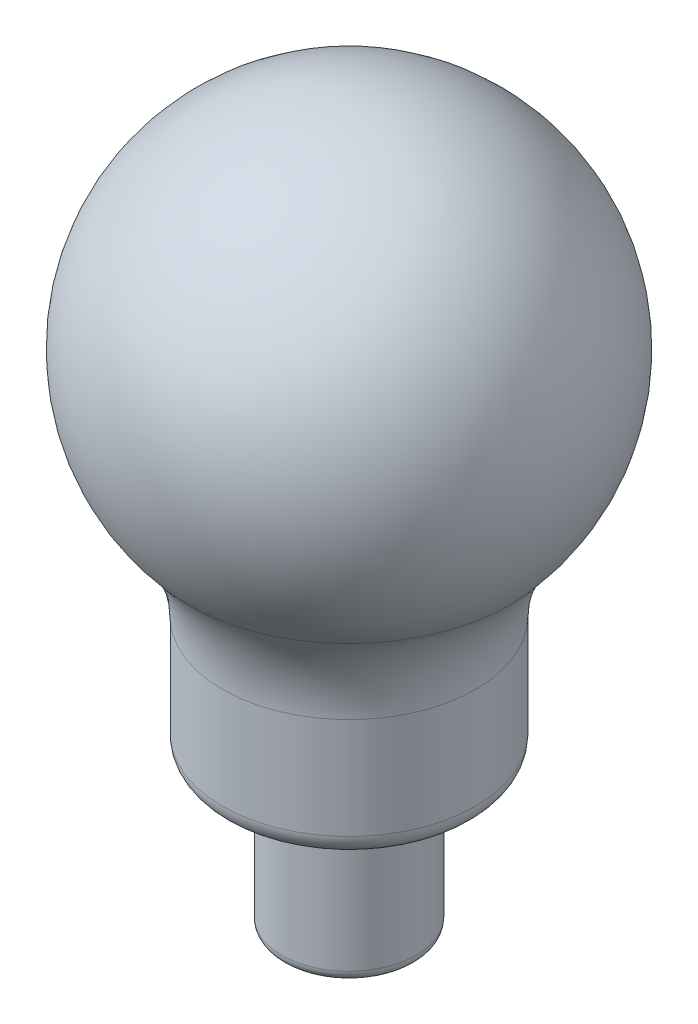
ISO-10303-21;
HEADER;
FILE_DESCRIPTION(('STEP AP214'),'2;1');
FILE_NAME('part.step','',(''),(''),'','','');
FILE_SCHEMA(('AUTOMOTIVE_DESIGN { 1 0 10303 214 1 1 1 1 }'));
ENDSEC;
DATA;
#1=APPLICATION_CONTEXT('core data for automotive mechanical design processes');
#2=APPLICATION_PROTOCOL_DEFINITION('international standard','automotive_design',2000,#1);
#3=PRODUCT_CONTEXT('',#1,'mechanical');
#4=PRODUCT('Part','Part','',(#3));
#5=PRODUCT_RELATED_PRODUCT_CATEGORY('part','',(#4));
#6=PRODUCT_DEFINITION_FORMATION('','',#4);
#7=PRODUCT_DEFINITION_CONTEXT('part definition',#1,'design');
#8=PRODUCT_DEFINITION('design','',#6,#7);
#9=PRODUCT_DEFINITION_SHAPE('','',#8);
#10=(LENGTH_UNIT() NAMED_UNIT(*) SI_UNIT(.MILLI.,.METRE.));
#11=(NAMED_UNIT(*) PLANE_ANGLE_UNIT() SI_UNIT($,.RADIAN.));
#12=(NAMED_UNIT(*) SI_UNIT($,.STERADIAN.) SOLID_ANGLE_UNIT());
#13=UNCERTAINTY_MEASURE_WITH_UNIT(LENGTH_MEASURE(1.E-05),#10,'distance_accuracy_value','');
#14=(GEOMETRIC_REPRESENTATION_CONTEXT(3) GLOBAL_UNCERTAINTY_ASSIGNED_CONTEXT((#13)) GLOBAL_UNIT_ASSIGNED_CONTEXT((#10,
#11,#12)) REPRESENTATION_CONTEXT('',''));
#15=CARTESIAN_POINT('',(0.,0.,0.));
#16=DIRECTION('',(0.,0.,1.));
#17=DIRECTION('',(1.,0.,0.));
#18=AXIS2_PLACEMENT_3D('',#15,#16,#17);
#19=CARTESIAN_POINT('',(0.,8.94158639065383,0.));
#20=DIRECTION('',(0.,1.,0.));
#21=DIRECTION('',(0.,0.,1.));
#22=AXIS2_PLACEMENT_3D('',#19,#20,#21);
#23=TOROIDAL_SURFACE('',#22,9.97299999999999,0.999999999999999);
#24=CARTESIAN_POINT('',(0.,9.94158639065383,0.));
#25=DIRECTION('',(0.,1.,0.));
#26=DIRECTION('',(0.,0.,1.));
#27=AXIS2_PLACEMENT_3D('',#24,#25,#26);
#28=CIRCLE('',#27,9.973);
#29=CARTESIAN_POINT('',(0.,9.94158639065383,9.973));
#30=VERTEX_POINT('',#29);
#31=EDGE_CURVE('E11',#30,#30,#28,.T.);
#32=ORIENTED_EDGE('',*,*,#31,.T.);
#33=EDGE_LOOP('',(#32));
#34=FACE_BOUND('',#33,.T.);
#35=CARTESIAN_POINT('',(0.,8.94158639065383,0.));
#36=DIRECTION('',(0.,1.,0.));
#37=DIRECTION('',(0.,0.,1.));
#38=AXIS2_PLACEMENT_3D('',#35,#36,#37);
#39=CIRCLE('',#38,8.97299999999999);
#40=CARTESIAN_POINT('',(0.,8.94158639065383,8.97299999999999));
#41=VERTEX_POINT('',#40);
#42=EDGE_CURVE('E91',#41,#41,#39,.T.);
#43=ORIENTED_EDGE('',*,*,#42,.F.);
#44=EDGE_LOOP('',(#43));
#45=FACE_BOUND('',#44,.T.);
#46=ADVANCED_FACE('F39',(#34,#45),#23,.T.);
#47=CARTESIAN_POINT('',(-14.9728427956549,9.94158639065383,0.));
#48=DIRECTION('',(0.,1.,0.));
#49=DIRECTION('',(0.,0.,1.));
#50=AXIS2_PLACEMENT_3D('',#47,#48,#49);
#51=PLANE('',#50);
#52=CARTESIAN_POINT('',(0.,9.94158639065383,0.));
#53=DIRECTION('',(0.,1.,0.));
#54=DIRECTION('',(0.,0.,1.));
#55=AXIS2_PLACEMENT_3D('',#52,#53,#54);
#56=CIRCLE('',#55,14.9728427956549);
#57=CARTESIAN_POINT('',(0.,9.94158639065383,14.9728427956549));
#58=VERTEX_POINT('',#57);
#59=EDGE_CURVE('E45',#58,#58,#56,.T.);
#60=ORIENTED_EDGE('',*,*,#59,.T.);
#61=EDGE_LOOP('',(#60));
#62=FACE_BOUND('',#61,.T.);
#63=ORIENTED_EDGE('',*,*,#31,.F.);
#64=EDGE_LOOP('',(#63));
#65=FACE_BOUND('',#64,.T.);
#66=ADVANCED_FACE('F99',(#62,#65),#51,.T.);
#67=CARTESIAN_POINT('',(0.,12.4415863906538,0.));
#68=DIRECTION('',(0.,1.,0.));
#69=DIRECTION('',(0.,0.,1.));
#70=AXIS2_PLACEMENT_3D('',#67,#68,#69);
#71=TOROIDAL_SURFACE('',#70,14.9728427956549,2.5);
#72=CARTESIAN_POINT('',(0.,12.4415863906538,0.));
#73=DIRECTION('',(0.,1.,0.));
#74=DIRECTION('',(0.,0.,1.));
#75=AXIS2_PLACEMENT_3D('',#72,#73,#74);
#76=CIRCLE('',#75,17.4728427956549);
#77=CARTESIAN_POINT('',(0.,12.4415863906538,17.4728427956549));
#78=VERTEX_POINT('',#77);
#79=EDGE_CURVE('E49',#78,#78,#76,.T.);
#80=ORIENTED_EDGE('',*,*,#79,.T.);
#81=EDGE_LOOP('',(#80));
#82=FACE_BOUND('',#81,.T.);
#83=ORIENTED_EDGE('',*,*,#59,.F.);
#84=EDGE_LOOP('',(#83));
#85=FACE_BOUND('',#84,.T.);
#86=ADVANCED_FACE('F103',(#82,#85),#71,.F.);
#87=CARTESIAN_POINT('',(0.,100.,0.));
#88=DIRECTION('',(0.,1.,0.));
#89=DIRECTION('',(0.,0.,1.));
#90=AXIS2_PLACEMENT_3D('',#87,#88,#89);
#91=CYLINDRICAL_SURFACE('',#90,17.4728427956549);
#92=CARTESIAN_POINT('',(0.,26.8973406987877,0.));
#93=DIRECTION('',(0.,1.,0.));
#94=DIRECTION('',(0.,0.,1.));
#95=AXIS2_PLACEMENT_3D('',#92,#93,#94);
#96=CIRCLE('',#95,17.4728427956549);
#97=CARTESIAN_POINT('',(0.,26.8973406987877,17.4728427956549));
#98=VERTEX_POINT('',#97);
#99=EDGE_CURVE('E53',#98,#98,#96,.T.);
#100=ORIENTED_EDGE('',*,*,#99,.T.);
#101=EDGE_LOOP('',(#100));
#102=FACE_BOUND('',#101,.T.);
#103=ORIENTED_EDGE('',*,*,#79,.F.);
#104=EDGE_LOOP('',(#103));
#105=FACE_BOUND('',#104,.T.);
#106=ADVANCED_FACE('F107',(#102,#105),#91,.F.);
#107=CARTESIAN_POINT('',(0.,26.8973406987877,0.));
#108=DIRECTION('',(0.,1.,0.));
#109=DIRECTION('',(0.,0.,1.));
#110=AXIS2_PLACEMENT_3D('',#107,#108,#109);
#111=TOROIDAL_SURFACE('',#110,37.4728427956549,20.);
#112=CARTESIAN_POINT('',(0.,40.1384044192726,0.));
#113=DIRECTION('',(0.,1.,0.));
#114=DIRECTION('',(0.,0.,1.));
#115=AXIS2_PLACEMENT_3D('',#112,#113,#114);
#116=CIRCLE('',#115,22.4837056773929);
#117=CARTESIAN_POINT('',(0.,40.1384044192726,22.4837056773929));
#118=VERTEX_POINT('',#117);
#119=EDGE_CURVE('E58',#118,#118,#116,.T.);
#120=ORIENTED_EDGE('',*,*,#119,.T.);
#121=EDGE_LOOP('',(#120));
#122=FACE_BOUND('',#121,.T.);
#123=ORIENTED_EDGE('',*,*,#99,.F.);
#124=EDGE_LOOP('',(#123));
#125=FACE_BOUND('',#124,.T.);
#126=ADVANCED_FACE('F114',(#122,#125),#111,.T.);
#127=CARTESIAN_POINT('',(0.,60.,0.));
#128=DIRECTION('',(0.,1.,0.));
#129=DIRECTION('',(-1.,0.,0.));
#130=AXIS2_PLACEMENT_3D('',#127,#128,#129);
#131=SPHERICAL_SURFACE('',#130,30.);
#132=ORIENTED_EDGE('',*,*,#119,.F.);
#133=EDGE_LOOP('',(#132));
#134=FACE_BOUND('',#133,.T.);
#135=ADVANCED_FACE('F118',(#134),#131,.F.);
#136=CARTESIAN_POINT('',(0.,60.,0.));
#137=DIRECTION('',(0.,1.,0.));
#138=DIRECTION('',(1.,0.,0.));
#139=AXIS2_PLACEMENT_3D('',#136,#137,#138);
#140=SPHERICAL_SURFACE('',#139,30.6);
#141=CARTESIAN_POINT('',(0.,39.7411725076581,0.));
#142=DIRECTION('',(0.,1.,0.));
#143=DIRECTION('',(0.,0.,1.));
#144=AXIS2_PLACEMENT_3D('',#141,#142,#143);
#145=CIRCLE('',#144,22.9333797909408);
#146=CARTESIAN_POINT('',(0.,39.7411725076581,22.9333797909408));
#147=VERTEX_POINT('',#146);
#148=EDGE_CURVE('E61',#147,#147,#145,.T.);
#149=ORIENTED_EDGE('',*,*,#148,.T.);
#150=EDGE_LOOP('',(#149));
#151=FACE_BOUND('',#150,.T.);
#152=ADVANCED_FACE('F122',(#151),#140,.T.);
#153=CARTESIAN_POINT('',(0.,26.8973406987877,0.));
#154=DIRECTION('',(0.,1.,0.));
#155=DIRECTION('',(0.,0.,1.));
#156=AXIS2_PLACEMENT_3D('',#153,#154,#155);
#157=TOROIDAL_SURFACE('',#156,37.4728427956549,19.4);
#158=CARTESIAN_POINT('',(0.,26.8973406987877,0.));
#159=DIRECTION('',(0.,1.,0.));
#160=DIRECTION('',(0.,0.,1.));
#161=AXIS2_PLACEMENT_3D('',#158,#159,#160);
#162=CIRCLE('',#161,18.0728427956549);
#163=CARTESIAN_POINT('',(0.,26.8973406987877,18.0728427956549));
#164=VERTEX_POINT('',#163);
#165=EDGE_CURVE('E64',#164,#164,#162,.T.);
#166=ORIENTED_EDGE('',*,*,#165,.T.);
#167=EDGE_LOOP('',(#166));
#168=FACE_BOUND('',#167,.T.);
#169=ORIENTED_EDGE('',*,*,#148,.F.);
#170=EDGE_LOOP('',(#169));
#171=FACE_BOUND('',#170,.T.);
#172=ADVANCED_FACE('F126',(#168,#171),#157,.F.);
#173=CARTESIAN_POINT('',(0.,100.,0.));
#174=DIRECTION('',(0.,1.,0.));
#175=DIRECTION('',(0.,0.,1.));
#176=AXIS2_PLACEMENT_3D('',#173,#174,#175);
#177=CYLINDRICAL_SURFACE('',#176,18.0728427956549);
#178=CARTESIAN_POINT('',(0.,12.4415863906538,0.));
#179=DIRECTION('',(0.,1.,0.));
#180=DIRECTION('',(0.,0.,1.));
#181=AXIS2_PLACEMENT_3D('',#178,#179,#180);
#182=CIRCLE('',#181,18.0728427956549);
#183=CARTESIAN_POINT('',(0.,12.4415863906538,18.0728427956549));
#184=VERTEX_POINT('',#183);
#185=EDGE_CURVE('E67',#184,#184,#182,.T.);
#186=ORIENTED_EDGE('',*,*,#185,.T.);
#187=EDGE_LOOP('',(#186));
#188=FACE_BOUND('',#187,.T.);
#189=ORIENTED_EDGE('',*,*,#165,.F.);
#190=EDGE_LOOP('',(#189));
#191=FACE_BOUND('',#190,.T.);
#192=ADVANCED_FACE('F130',(#188,#191),#177,.T.);
#193=CARTESIAN_POINT('',(0.,12.4415863906538,0.));
#194=DIRECTION('',(0.,1.,0.));
#195=DIRECTION('',(0.,0.,1.));
#196=AXIS2_PLACEMENT_3D('',#193,#194,#195);
#197=TOROIDAL_SURFACE('',#196,14.9728427956549,3.1);
#198=CARTESIAN_POINT('',(0.,9.34158639065383,0.));
#199=DIRECTION('',(0.,1.,0.));
#200=DIRECTION('',(0.,0.,1.));
#201=AXIS2_PLACEMENT_3D('',#198,#199,#200);
#202=CIRCLE('',#201,14.9728427956549);
#203=CARTESIAN_POINT('',(0.,9.34158639065383,14.9728427956549));
#204=VERTEX_POINT('',#203);
#205=EDGE_CURVE('E70',#204,#204,#202,.T.);
#206=ORIENTED_EDGE('',*,*,#205,.T.);
#207=EDGE_LOOP('',(#206));
#208=FACE_BOUND('',#207,.T.);
#209=ORIENTED_EDGE('',*,*,#185,.F.);
#210=EDGE_LOOP('',(#209));
#211=FACE_BOUND('',#210,.T.);
#212=ADVANCED_FACE('F134',(#208,#211),#197,.T.);
#213=CARTESIAN_POINT('',(-14.9728427956549,9.34158639065383,0.));
#214=DIRECTION('',(0.,-1.,0.));
#215=DIRECTION('',(0.,0.,-1.));
#216=AXIS2_PLACEMENT_3D('',#213,#214,#215);
#217=PLANE('',#216);
#218=CARTESIAN_POINT('',(0.,9.34158639065383,0.));
#219=DIRECTION('',(0.,1.,0.));
#220=DIRECTION('',(0.,0.,1.));
#221=AXIS2_PLACEMENT_3D('',#218,#219,#220);
#222=CIRCLE('',#221,9.973);
#223=CARTESIAN_POINT('',(0.,9.34158639065383,9.973));
#224=VERTEX_POINT('',#223);
#225=EDGE_CURVE('E73',#224,#224,#222,.T.);
#226=ORIENTED_EDGE('',*,*,#225,.T.);
#227=EDGE_LOOP('',(#226));
#228=FACE_BOUND('',#227,.T.);
#229=ORIENTED_EDGE('',*,*,#205,.F.);
#230=EDGE_LOOP('',(#229));
#231=FACE_BOUND('',#230,.T.);
#232=ADVANCED_FACE('F138',(#228,#231),#217,.T.);
#233=CARTESIAN_POINT('',(0.,8.94158639065383,0.));
#234=DIRECTION('',(0.,1.,0.));
#235=DIRECTION('',(0.,0.,1.));
#236=AXIS2_PLACEMENT_3D('',#233,#234,#235);
#237=TOROIDAL_SURFACE('',#236,9.97299999999999,0.399999999999999);
#238=CARTESIAN_POINT('',(0.,8.94158639065383,0.));
#239=DIRECTION('',(0.,1.,0.));
#240=DIRECTION('',(0.,0.,1.));
#241=AXIS2_PLACEMENT_3D('',#238,#239,#240);
#242=CIRCLE('',#241,9.57299999999999);
#243=CARTESIAN_POINT('',(0.,8.94158639065383,9.57299999999999));
#244=VERTEX_POINT('',#243);
#245=EDGE_CURVE('E76',#244,#244,#242,.T.);
#246=ORIENTED_EDGE('',*,*,#245,.T.);
#247=EDGE_LOOP('',(#246));
#248=FACE_BOUND('',#247,.T.);
#249=ORIENTED_EDGE('',*,*,#225,.F.);
#250=EDGE_LOOP('',(#249));
#251=FACE_BOUND('',#250,.T.);
#252=ADVANCED_FACE('F142',(#248,#251),#237,.F.);
#253=CARTESIAN_POINT('',(0.,100.,0.));
#254=DIRECTION('',(0.,1.,0.));
#255=DIRECTION('',(0.,0.,1.));
#256=AXIS2_PLACEMENT_3D('',#253,#254,#255);
#257=CYLINDRICAL_SURFACE('',#256,9.57299999999999);
#258=CARTESIAN_POINT('',(0.,-10.2512810002049,0.));
#259=DIRECTION('',(0.,1.,0.));
#260=DIRECTION('',(0.,0.,1.));
#261=AXIS2_PLACEMENT_3D('',#258,#259,#260);
#262=CIRCLE('',#261,9.57299999999999);
#263=CARTESIAN_POINT('',(0.,-10.2512810002049,9.57299999999999));
#264=VERTEX_POINT('',#263);
#265=EDGE_CURVE('E79',#264,#264,#262,.T.);
#266=ORIENTED_EDGE('',*,*,#265,.T.);
#267=EDGE_LOOP('',(#266));
#268=FACE_BOUND('',#267,.T.);
#269=ORIENTED_EDGE('',*,*,#245,.F.);
#270=EDGE_LOOP('',(#269));
#271=FACE_BOUND('',#270,.T.);
#272=ADVANCED_FACE('F146',(#268,#271),#257,.T.);
#273=CARTESIAN_POINT('',(0.,-10.2512810002049,0.));
#274=DIRECTION('',(0.,1.,0.));
#275=DIRECTION('',(0.,0.,1.));
#276=AXIS2_PLACEMENT_3D('',#273,#274,#275);
#277=TOROIDAL_SURFACE('',#276,7.97299999999999,1.6);
#278=CARTESIAN_POINT('',(0.,-11.8512810002049,0.));
#279=DIRECTION('',(0.,1.,0.));
#280=DIRECTION('',(0.,0.,1.));
#281=AXIS2_PLACEMENT_3D('',#278,#279,#280);
#282=CIRCLE('',#281,7.97299999999998);
#283=CARTESIAN_POINT('',(0.,-11.8512810002049,7.97299999999998));
#284=VERTEX_POINT('',#283);
#285=EDGE_CURVE('E82',#284,#284,#282,.T.);
#286=ORIENTED_EDGE('',*,*,#285,.T.);
#287=EDGE_LOOP('',(#286));
#288=FACE_BOUND('',#287,.T.);
#289=ORIENTED_EDGE('',*,*,#265,.F.);
#290=EDGE_LOOP('',(#289));
#291=FACE_BOUND('',#290,.T.);
#292=ADVANCED_FACE('F150',(#288,#291),#277,.T.);
#293=CARTESIAN_POINT('',(0.,100.,0.));
#294=DIRECTION('',(0.,1.,0.));
#295=DIRECTION('',(0.,0.,1.));
#296=AXIS2_PLACEMENT_3D('',#293,#294,#295);
#297=CYLINDRICAL_SURFACE('',#296,7.97299999999998);
#298=CARTESIAN_POINT('',(0.,-11.2512810002049,0.));
#299=DIRECTION('',(0.,1.,0.));
#300=DIRECTION('',(0.,0.,1.));
#301=AXIS2_PLACEMENT_3D('',#298,#299,#300);
#302=CIRCLE('',#301,7.97299999999998);
#303=CARTESIAN_POINT('',(0.,-11.2512810002049,7.97299999999998));
#304=VERTEX_POINT('',#303);
#305=EDGE_CURVE('E85',#304,#304,#302,.T.);
#306=ORIENTED_EDGE('',*,*,#305,.T.);
#307=EDGE_LOOP('',(#306));
#308=FACE_BOUND('',#307,.T.);
#309=ORIENTED_EDGE('',*,*,#285,.F.);
#310=EDGE_LOOP('',(#309));
#311=FACE_BOUND('',#310,.T.);
#312=ADVANCED_FACE('F154',(#308,#311),#297,.F.);
#313=CARTESIAN_POINT('',(0.,-10.2512810002049,0.));
#314=DIRECTION('',(0.,1.,0.));
#315=DIRECTION('',(0.,0.,1.));
#316=AXIS2_PLACEMENT_3D('',#313,#314,#315);
#317=TOROIDAL_SURFACE('',#316,7.97299999999999,1.);
#318=CARTESIAN_POINT('',(0.,-10.2512810002049,0.));
#319=DIRECTION('',(0.,1.,0.));
#320=DIRECTION('',(0.,0.,1.));
#321=AXIS2_PLACEMENT_3D('',#318,#319,#320);
#322=CIRCLE('',#321,8.97299999999999);
#323=CARTESIAN_POINT('',(0.,-10.2512810002049,8.97299999999999));
#324=VERTEX_POINT('',#323);
#325=EDGE_CURVE('E88',#324,#324,#322,.T.);
#326=ORIENTED_EDGE('',*,*,#325,.T.);
#327=EDGE_LOOP('',(#326));
#328=FACE_BOUND('',#327,.T.);
#329=ORIENTED_EDGE('',*,*,#305,.F.);
#330=EDGE_LOOP('',(#329));
#331=FACE_BOUND('',#330,.T.);
#332=ADVANCED_FACE('F158',(#328,#331),#317,.F.);
#333=CARTESIAN_POINT('',(0.,100.,0.));
#334=DIRECTION('',(0.,1.,0.));
#335=DIRECTION('',(0.,0.,1.));
#336=AXIS2_PLACEMENT_3D('',#333,#334,#335);
#337=CYLINDRICAL_SURFACE('',#336,8.97299999999999);
#338=ORIENTED_EDGE('',*,*,#42,.T.);
#339=EDGE_LOOP('',(#338));
#340=FACE_BOUND('',#339,.T.);
#341=ORIENTED_EDGE('',*,*,#325,.F.);
#342=EDGE_LOOP('',(#341));
#343=FACE_BOUND('',#342,.T.);
#344=ADVANCED_FACE('F95',(#340,#343),#337,.F.);
#345=CLOSED_SHELL('',(#46,#66,#86,#106,#126,#135,#152,#172,#192,#212,#232,#252,#272,#292,#312,
#332,#344));
#346=MANIFOLD_SOLID_BREP('B2',#345);
#347=CARTESIAN_POINT('',(-7.7,49.097,0.));
#348=DIRECTION('',(1.,0.,0.));
#349=DIRECTION('',(0.,0.,-1.));
#350=AXIS2_PLACEMENT_3D('',#347,#348,#349);
#351=CYLINDRICAL_SURFACE('',#350,0.0479999999999986);
#352=CARTESIAN_POINT('',(7.00230933301899,49.097,-0.0479999999999986));
#353=CARTESIAN_POINT('',(7.00230930266696,49.0996895075727,-0.047999883232924));
#354=CARTESIAN_POINT('',(7.00228729708405,49.1023808069732,-0.0477731935693393));
#355=CARTESIAN_POINT('',(7.00220166169893,49.1076888276721,-0.0468722863439702));
#356=CARTESIAN_POINT('',(7.0021379856947,49.1103054628221,-0.0461975720233539));
#357=CARTESIAN_POINT('',(7.00197628717147,49.1153865158055,-0.0444204090654712));
#358=CARTESIAN_POINT('',(7.00187828513167,49.1178510233707,-0.0433182154240125));
#359=CARTESIAN_POINT('',(7.00165900220641,49.1225595112204,-0.0407178618207318));
#360=CARTESIAN_POINT('',(7.00153772603618,49.1248035360346,-0.0392197820403133));
#361=CARTESIAN_POINT('',(7.00128510264949,49.1290154498882,-0.0358647635404424));
#362=CARTESIAN_POINT('',(7.0011537264252,49.1309824938507,-0.0340067659880318));
#363=CARTESIAN_POINT('',(7.00089596958146,49.1345773359073,-0.0299869115515825));
#364=CARTESIAN_POINT('',(7.00076958918812,49.1362051186616,-0.0278250409351209));
#365=CARTESIAN_POINT('',(7.00053577971842,49.1390781281495,-0.0232536612173523));
#366=CARTESIAN_POINT('',(7.00042838767946,49.1403226106746,-0.0208436823421606));
#367=CARTESIAN_POINT('',(7.00024497006607,49.1423889326433,-0.0158477619218664));
#368=CARTESIAN_POINT('',(7.00016894378248,49.1432107816425,-0.0132618243566082));
#369=CARTESIAN_POINT('',(7.00005702719059,49.1444060389516,-0.00799590299932323));
#370=CARTESIAN_POINT('',(7.00002101308488,49.1447808307201,-0.00531623589705897));
#371=CARTESIAN_POINT('',(6.99999275798639,49.1450756142745,6.81931182974931E-05));
#372=CARTESIAN_POINT('',(7.00000051594086,49.1449956169982,0.00277295442630057));
#373=CARTESIAN_POINT('',(7.00005882932153,49.1443842184657,0.0081214048292463));
#374=CARTESIAN_POINT('',(7.0001092437023,49.1438543048586,0.0107652657344647));
#375=CARTESIAN_POINT('',(7.00024704088253,49.1423604324022,0.0159263477785679));
#376=CARTESIAN_POINT('',(7.00033442412975,49.1413964682958,0.0184435673831686));
#377=CARTESIAN_POINT('',(7.00053657568744,49.1390602202163,0.0232846129154504));
#378=CARTESIAN_POINT('',(7.00065138822569,49.1376872759,0.025608118245333));
#379=CARTESIAN_POINT('',(7.0008955104151,49.1345725197186,0.0299922809416684));
#380=CARTESIAN_POINT('',(7.0010248204578,49.1328306978897,0.0320529312056836));
#381=CARTESIAN_POINT('',(7.00128403659131,49.1290192594514,0.035861598936554));
#382=CARTESIAN_POINT('',(7.00141394298263,49.1269483490953,0.0376083219533884));
#383=CARTESIAN_POINT('',(7.00165918907371,49.1225420106192,0.0407295359363812));
#384=CARTESIAN_POINT('',(7.00177452875497,49.1202065821631,0.0421040264295168));
#385=CARTESIAN_POINT('',(7.00197759542056,49.1153365289654,0.0444417413347907));
#386=CARTESIAN_POINT('',(7.00206531725542,49.1128018671858,0.0454048890621949));
#387=CARTESIAN_POINT('',(7.00220311072773,49.1076057737464,0.0468915707855103));
#388=CARTESIAN_POINT('',(7.00225318342052,49.1049443456423,0.0474151171040322));
#389=CARTESIAN_POINT('',(7.00230982918611,49.0995816221512,0.0480060761233676));
#390=CARTESIAN_POINT('',(7.00231657481603,49.0968805279084,0.0480752982687271));
#391=CARTESIAN_POINT('',(7.00228625805865,49.0915051771425,0.0477603928501225));
#392=CARTESIAN_POINT('',(7.00224919621609,49.088830920286,0.0473762709234338));
#393=CARTESIAN_POINT('',(7.00213559751232,49.0835904104511,0.0461670936651684));
#394=CARTESIAN_POINT('',(7.00205913700135,49.0810239589241,0.0453428910494384));
#395=CARTESIAN_POINT('',(7.00187541840186,49.0760657456176,0.0432778180946105));
#396=CARTESIAN_POINT('',(7.00176815966166,49.0736739875361,0.0420369389384441));
#397=CARTESIAN_POINT('',(7.00153451205101,49.0691247984639,0.0391691923336989));
#398=CARTESIAN_POINT('',(7.00140806412065,49.0669681275021,0.0375411241154885));
#399=CARTESIAN_POINT('',(7.00115048051445,49.0629580332522,0.03394693869455));
#400=CARTESIAN_POINT('',(7.00101934473172,49.0611046168841,0.031980813779712));
#401=CARTESIAN_POINT('',(7.00076664200064,49.0577474199408,0.0277584840747868));
#402=CARTESIAN_POINT('',(7.00064510820756,49.0562448185506,0.0255013394485713));
#403=CARTESIAN_POINT('',(7.00042578443142,49.053640013195,0.0207656949231318));
#404=CARTESIAN_POINT('',(7.0003279941453,49.0525378041191,0.0182871978497242));
#405=CARTESIAN_POINT('',(7.00016732613603,49.0507670760334,0.0131833480064804));
#406=CARTESIAN_POINT('',(7.00010439075404,49.0500978404656,0.0105582457278043));
#407=CARTESIAN_POINT('',(7.00002028768902,49.0492097170795,0.00523230023936201));
#408=CARTESIAN_POINT('',(6.99999911893062,49.0489908176662,0.0025314589814869));
#409=CARTESIAN_POINT('',(7.00000093423142,49.0490097360887,-0.00285770476861303));
#410=CARTESIAN_POINT('',(7.00002374114694,49.0492457215471,-0.00554603394138654));
#411=CARTESIAN_POINT('',(7.00011059556989,49.0501638740117,-0.0108446764653105));
#412=CARTESIAN_POINT('',(7.00017464311642,49.0508460414409,-0.0134549897425));
#413=CARTESIAN_POINT('',(7.0003368002899,49.0526366963217,-0.0185235223720819));
#414=CARTESIAN_POINT('',(7.00043490604242,49.0537451352825,-0.0209817589871126));
#415=CARTESIAN_POINT('',(7.00065423357766,49.0563566705673,-0.0256775703944309));
#416=CARTESIAN_POINT('',(7.00077545516651,49.0578597635817,-0.0279151470369815));
#417=CARTESIAN_POINT('',(7.0010280109915,49.0612248164068,-0.0321155114125929));
#418=CARTESIAN_POINT('',(7.00115938246202,49.063088139264,-0.0340772049396102));
#419=CARTESIAN_POINT('',(7.00141711568267,49.0671181145836,-0.0376609156921393));
#420=CARTESIAN_POINT('',(7.00154347622031,49.0692848398926,-0.0392828511078121));
#421=CARTESIAN_POINT('',(7.00177720179631,49.0738656676868,-0.0421439821509997));
#422=CARTESIAN_POINT('',(7.00188452113768,49.0762803438971,-0.0433822622146763));
#423=CARTESIAN_POINT('',(7.00206746600819,49.0812828079893,-0.045434155899887));
#424=CARTESIAN_POINT('',(7.00214312744392,49.0838703958678,-0.0462482508933842));
#425=CARTESIAN_POINT('',(7.00223501179952,49.0882273301358,-0.0472245404422306));
#426=CARTESIAN_POINT('',(7.00226275140546,49.0899687771,-0.0475149431609183));
#427=CARTESIAN_POINT('',(7.00229992193291,49.0934732258933,-0.0479027108618374));
#428=CARTESIAN_POINT('',(7.00230935292378,49.0952362276406,-0.0480000765755549));
#429=CARTESIAN_POINT('',(7.00230933301899,49.097,-0.0479999999999986));
#430=B_SPLINE_CURVE_WITH_KNOTS('',3,(#352,#353,#354,#355,#356,#357,#358,#359,#360,#361,#362,
#363,#364,#365,#366,#367,#368,#369,#370,#371,#372,#373,#374,#375,#376,#377,#378,#379,#380,#381,
#382,#383,#384,#385,#386,#387,#388,#389,#390,#391,#392,#393,#394,#395,#396,#397,#398,#399,#400,
#401,#402,#403,#404,#405,#406,#407,#408,#409,#410,#411,#412,#413,#414,#415,#416,#417,#418,#419,
#420,#421,#422,#423,#424,#425,#426,#427,#428,#429),.UNSPECIFIED.,.T.,.F.,(4,2,2,2,2,2,2,2,2,2,2,
2,2,2,2,2,2,2,2,2,2,2,2,2,2,2,2,2,2,2,2,2,2,2,2,2,2,2,4),(0.,0.00806208202537197,
0.0161331180507106,0.0241993470065252,0.0322639435067899,0.0403526355813785,0.0484416933121785,
0.0565463590153608,0.0646508414676197,0.0727301782623713,0.0808093207461866,0.0888618531037899,
0.0969144829959088,0.104980185869109,0.113046106634332,0.121144559347393,0.129243022351698,
0.137342994456774,0.145442739501305,0.153510205877004,0.161577571935848,0.16962936280755,
0.177681324069609,0.185758589801244,0.193836039824531,0.201940261566197,0.210044379863018,
0.218135051544243,0.226225514909693,0.234283456183633,0.242341405096454,0.250398437644733,
0.258455402627989,0.266543472512806,0.274633487678719,0.28274266292514,0.290842615597454,
0.296129728920223,0.301416822208195),.UNSPECIFIED.);
#431=CARTESIAN_POINT('',(7.00230933301899,49.097,-0.0479999999999986));
#432=VERTEX_POINT('',#431);
#433=EDGE_CURVE('E308',#432,#432,#430,.T.);
#434=ORIENTED_EDGE('',*,*,#433,.F.);
#435=EDGE_LOOP('',(#434));
#436=FACE_BOUND('',#435,.T.);
#437=CARTESIAN_POINT('',(-7.00230933301899,49.097,-0.0479999999999986));
#438=CARTESIAN_POINT('',(-7.00230930266696,49.0996895075727,-0.047999883232924));
#439=CARTESIAN_POINT('',(-7.00228729708405,49.1023808069732,-0.0477731935693393));
#440=CARTESIAN_POINT('',(-7.00220166169893,49.1076888276721,-0.0468722863439702));
#441=CARTESIAN_POINT('',(-7.0021379856947,49.1103054628221,-0.0461975720233539));
#442=CARTESIAN_POINT('',(-7.00197628717147,49.1153865158055,-0.0444204090654712));
#443=CARTESIAN_POINT('',(-7.00187828513167,49.1178510233707,-0.0433182154240125));
#444=CARTESIAN_POINT('',(-7.00165900220641,49.1225595112204,-0.0407178618207318));
#445=CARTESIAN_POINT('',(-7.00153772603618,49.1248035360346,-0.0392197820403133));
#446=CARTESIAN_POINT('',(-7.00128510264949,49.1290154498882,-0.0358647635404424));
#447=CARTESIAN_POINT('',(-7.0011537264252,49.1309824938507,-0.0340067659880318));
#448=CARTESIAN_POINT('',(-7.00089596958146,49.1345773359073,-0.0299869115515825));
#449=CARTESIAN_POINT('',(-7.00076958918812,49.1362051186616,-0.0278250409351209));
#450=CARTESIAN_POINT('',(-7.00053577971842,49.1390781281495,-0.0232536612173523));
#451=CARTESIAN_POINT('',(-7.00042838767946,49.1403226106746,-0.0208436823421606));
#452=CARTESIAN_POINT('',(-7.00024497006607,49.1423889326433,-0.0158477619218664));
#453=CARTESIAN_POINT('',(-7.00016894378248,49.1432107816425,-0.0132618243566082));
#454=CARTESIAN_POINT('',(-7.00005702719059,49.1444060389516,-0.0079959029993233));
#455=CARTESIAN_POINT('',(-7.00002101308488,49.1447808307201,-0.00531623589705905));
#456=CARTESIAN_POINT('',(-6.99999275798639,49.1450756142745,6.81931182974202E-05));
#457=CARTESIAN_POINT('',(-7.00000051594086,49.1449956169982,0.00277295442630049));
#458=CARTESIAN_POINT('',(-7.00005882932153,49.1443842184657,0.00812140482924625));
#459=CARTESIAN_POINT('',(-7.0001092437023,49.1438543048586,0.0107652657344647));
#460=CARTESIAN_POINT('',(-7.00024704088253,49.1423604324022,0.0159263477785679));
#461=CARTESIAN_POINT('',(-7.00033442412975,49.1413964682958,0.0184435673831686));
#462=CARTESIAN_POINT('',(-7.00053657568744,49.1390602202163,0.0232846129154505));
#463=CARTESIAN_POINT('',(-7.00065138822569,49.1376872759,0.025608118245333));
#464=CARTESIAN_POINT('',(-7.0008955104151,49.1345725197186,0.0299922809416684));
#465=CARTESIAN_POINT('',(-7.0010248204578,49.1328306978897,0.0320529312056837));
#466=CARTESIAN_POINT('',(-7.00128403659131,49.1290192594514,0.0358615989365541));
#467=CARTESIAN_POINT('',(-7.00141394298263,49.1269483490953,0.0376083219533884));
#468=CARTESIAN_POINT('',(-7.00165918907371,49.1225420106192,0.0407295359363812));
#469=CARTESIAN_POINT('',(-7.00177452875497,49.1202065821631,0.0421040264295168));
#470=CARTESIAN_POINT('',(-7.00197759542056,49.1153365289654,0.0444417413347907));
#471=CARTESIAN_POINT('',(-7.00206531725542,49.1128018671858,0.0454048890621949));
#472=CARTESIAN_POINT('',(-7.00220311072773,49.1076057737464,0.0468915707855103));
#473=CARTESIAN_POINT('',(-7.00225318342052,49.1049443456423,0.0474151171040322));
#474=CARTESIAN_POINT('',(-7.00230982918611,49.0995816221512,0.0480060761233676));
#475=CARTESIAN_POINT('',(-7.00231657481603,49.0968805279084,0.0480752982687271));
#476=CARTESIAN_POINT('',(-7.00228625805865,49.0915051771425,0.0477603928501225));
#477=CARTESIAN_POINT('',(-7.00224919621609,49.088830920286,0.0473762709234338));
#478=CARTESIAN_POINT('',(-7.00213559751232,49.0835904104511,0.0461670936651684));
#479=CARTESIAN_POINT('',(-7.00205913700135,49.0810239589241,0.0453428910494384));
#480=CARTESIAN_POINT('',(-7.00187541840186,49.0760657456176,0.0432778180946105));
#481=CARTESIAN_POINT('',(-7.00176815966166,49.0736739875361,0.0420369389384441));
#482=CARTESIAN_POINT('',(-7.00153451205101,49.0691247984639,0.0391691923336988));
#483=CARTESIAN_POINT('',(-7.00140806412065,49.0669681275022,0.0375411241154883));
#484=CARTESIAN_POINT('',(-7.00115048051445,49.0629580332522,0.0339469386945502));
#485=CARTESIAN_POINT('',(-7.00101934473172,49.061104616884,0.0319808137797126));
#486=CARTESIAN_POINT('',(-7.00076664200064,49.0577474199408,0.0277584840747878));
#487=CARTESIAN_POINT('',(-7.00064510820756,49.0562448185506,0.0255013394485724));
#488=CARTESIAN_POINT('',(-7.00042578443142,49.053640013195,0.0207656949231332));
#489=CARTESIAN_POINT('',(-7.0003279941453,49.0525378041191,0.0182871978497255));
#490=CARTESIAN_POINT('',(-7.00016732613603,49.0507670760334,0.013183348006481));
#491=CARTESIAN_POINT('',(-7.00010439075404,49.0500978404656,0.0105582457278045));
#492=CARTESIAN_POINT('',(-7.00002028768902,49.0492097170795,0.00523230023936192));
#493=CARTESIAN_POINT('',(-6.99999911893062,49.0489908176662,0.00253145898148691));
#494=CARTESIAN_POINT('',(-7.00000093423142,49.0490097360887,-0.00285770476861289));
#495=CARTESIAN_POINT('',(-7.00002374114694,49.0492457215471,-0.00554603394138637));
#496=CARTESIAN_POINT('',(-7.00011059556989,49.0501638740117,-0.0108446764653106));
#497=CARTESIAN_POINT('',(-7.00017464311642,49.0508460414409,-0.0134549897425004));
#498=CARTESIAN_POINT('',(-7.0003368002899,49.0526366963217,-0.0185235223720841));
#499=CARTESIAN_POINT('',(-7.00043490604242,49.0537451352825,-0.0209817589871161));
#500=CARTESIAN_POINT('',(-7.00065423357766,49.0563566705673,-0.0256775703944343));
#501=CARTESIAN_POINT('',(-7.00077545516651,49.0578597635817,-0.0279151470369838));
#502=CARTESIAN_POINT('',(-7.0010280109915,49.0612248164068,-0.0321155114125922));
#503=CARTESIAN_POINT('',(-7.00115938246202,49.063088139264,-0.0340772049396073));
#504=CARTESIAN_POINT('',(-7.00141711568267,49.0671181145836,-0.0376609156921364));
#505=CARTESIAN_POINT('',(-7.00154347622031,49.0692848398926,-0.0392828511078112));
#506=CARTESIAN_POINT('',(-7.00177720179631,49.0738656676868,-0.0421439821510002));
#507=CARTESIAN_POINT('',(-7.00188452113768,49.0762803438971,-0.0433822622146764));
#508=CARTESIAN_POINT('',(-7.00206746600819,49.0812828079893,-0.0454341558998868));
#509=CARTESIAN_POINT('',(-7.00214312744392,49.0838703958678,-0.0462482508933842));
#510=CARTESIAN_POINT('',(-7.00223501179952,49.0882273301358,-0.0472245404422306));
#511=CARTESIAN_POINT('',(-7.00226275140546,49.0899687771,-0.0475149431609183));
#512=CARTESIAN_POINT('',(-7.00229992193291,49.0934732258933,-0.0479027108618374));
#513=CARTESIAN_POINT('',(-7.00230935292378,49.0952362276406,-0.0480000765755549));
#514=CARTESIAN_POINT('',(-7.00230933301899,49.097,-0.0479999999999986));
#515=B_SPLINE_CURVE_WITH_KNOTS('',3,(#437,#438,#439,#440,#441,#442,#443,#444,#445,#446,#447,
#448,#449,#450,#451,#452,#453,#454,#455,#456,#457,#458,#459,#460,#461,#462,#463,#464,#465,#466,
#467,#468,#469,#470,#471,#472,#473,#474,#475,#476,#477,#478,#479,#480,#481,#482,#483,#484,#485,
#486,#487,#488,#489,#490,#491,#492,#493,#494,#495,#496,#497,#498,#499,#500,#501,#502,#503,#504,
#505,#506,#507,#508,#509,#510,#511,#512,#513,#514),.UNSPECIFIED.,.T.,.F.,(4,2,2,2,2,2,2,2,2,2,2,
2,2,2,2,2,2,2,2,2,2,2,2,2,2,2,2,2,2,2,2,2,2,2,2,2,2,2,4),(0.,0.00806208202537197,
0.0161331180507106,0.0241993470065252,0.0322639435067899,0.0403526355813785,0.0484416933121785,
0.0565463590153608,0.0646508414676196,0.0727301782623712,0.0808093207461865,0.0888618531037899,
0.0969144829959088,0.104980185869109,0.113046106634332,0.121144559347394,0.129243022351699,
0.137342994456774,0.145442739501305,0.153510205877004,0.161577571935848,0.16962936280755,
0.17768132406961,0.185758589801244,0.193836039824531,0.201940261566191,0.210044379863017,
0.218135051544242,0.226225514909692,0.234283456183632,0.242341405096453,0.250398437644741,
0.258455402627988,0.266543472512802,0.274633487678717,0.282742662925138,0.290842615597452,
0.296129728920222,0.301416822208194),.UNSPECIFIED.);
#516=CARTESIAN_POINT('',(-7.00230933301899,49.097,-0.0479999999999986));
#517=VERTEX_POINT('',#516);
#518=EDGE_CURVE('E295',#517,#517,#515,.T.);
#519=ORIENTED_EDGE('',*,*,#518,.T.);
#520=EDGE_LOOP('',(#519));
#521=FACE_BOUND('',#520,.T.);
#522=ADVANCED_FACE('F290',(#436,#521),#351,.T.);
#523=CARTESIAN_POINT('',(7.5,50.,0.));
#524=DIRECTION('',(0.,-1.,0.));
#525=DIRECTION('',(0.,0.,-1.));
#526=AXIS2_PLACEMENT_3D('',#523,#524,#525);
#527=CYLINDRICAL_SURFACE('',#526,0.500000000000001);
#528=ORIENTED_EDGE('',*,*,#433,.T.);
#529=EDGE_LOOP('',(#528));
#530=FACE_BOUND('',#529,.T.);
#531=CARTESIAN_POINT('',(7.5,50.,0.));
#532=DIRECTION('',(0.,1.,0.));
#533=DIRECTION('',(0.,0.,1.));
#534=AXIS2_PLACEMENT_3D('',#531,#532,#533);
#535=CIRCLE('',#534,0.500000000000001);
#536=CARTESIAN_POINT('',(7.5,50.,0.500000000000001));
#537=VERTEX_POINT('',#536);
#538=EDGE_CURVE('E38',#537,#537,#535,.T.);
#539=ORIENTED_EDGE('',*,*,#538,.F.);
#540=EDGE_LOOP('',(#539));
#541=FACE_BOUND('',#540,.T.);
#542=CARTESIAN_POINT('',(7.5,0.,0.));
#543=DIRECTION('',(0.,1.,0.));
#544=DIRECTION('',(0.,0.,1.));
#545=AXIS2_PLACEMENT_3D('',#542,#543,#544);
#546=CIRCLE('',#545,0.500000000000001);
#547=CARTESIAN_POINT('',(7.5,0.,0.500000000000001));
#548=VERTEX_POINT('',#547);
#549=EDGE_CURVE('E303',#548,#548,#546,.T.);
#550=ORIENTED_EDGE('',*,*,#549,.T.);
#551=EDGE_LOOP('',(#550));
#552=FACE_BOUND('',#551,.T.);
#553=ADVANCED_FACE('F292',(#530,#541,#552),#527,.T.);
#554=CARTESIAN_POINT('',(7.5,50.,0.));
#555=DIRECTION('',(0.,1.,0.));
#556=DIRECTION('',(0.,0.,1.));
#557=AXIS2_PLACEMENT_3D('',#554,#555,#556);
#558=PLANE('',#557);
#559=ORIENTED_EDGE('',*,*,#538,.T.);
#560=EDGE_LOOP('',(#559));
#561=FACE_BOUND('',#560,.T.);
#562=ADVANCED_FACE('F323',(#561),#558,.T.);
#563=CARTESIAN_POINT('',(7.5,0.,0.));
#564=DIRECTION('',(0.,1.,0.));
#565=DIRECTION('',(0.,0.,1.));
#566=AXIS2_PLACEMENT_3D('',#563,#564,#565);
#567=PLANE('',#566);
#568=ORIENTED_EDGE('',*,*,#549,.F.);
#569=EDGE_LOOP('',(#568));
#570=FACE_BOUND('',#569,.T.);
#571=ADVANCED_FACE('F326',(#570),#567,.F.);
#572=CARTESIAN_POINT('',(-7.5,50.,0.));
#573=DIRECTION('',(0.,-1.,0.));
#574=DIRECTION('',(0.,0.,-1.));
#575=AXIS2_PLACEMENT_3D('',#572,#573,#574);
#576=CYLINDRICAL_SURFACE('',#575,0.500000000000001);
#577=ORIENTED_EDGE('',*,*,#518,.F.);
#578=EDGE_LOOP('',(#577));
#579=FACE_BOUND('',#578,.T.);
#580=CARTESIAN_POINT('',(-7.5,50.,0.));
#581=DIRECTION('',(0.,1.,0.));
#582=DIRECTION('',(0.,0.,1.));
#583=AXIS2_PLACEMENT_3D('',#580,#581,#582);
#584=CIRCLE('',#583,0.500000000000001);
#585=CARTESIAN_POINT('',(-7.5,50.,0.500000000000001));
#586=VERTEX_POINT('',#585);
#587=EDGE_CURVE('E345',#586,#586,#584,.T.);
#588=ORIENTED_EDGE('',*,*,#587,.F.);
#589=EDGE_LOOP('',(#588));
#590=FACE_BOUND('',#589,.T.);
#591=CARTESIAN_POINT('',(-7.5,0.,0.));
#592=DIRECTION('',(0.,1.,0.));
#593=DIRECTION('',(0.,0.,1.));
#594=AXIS2_PLACEMENT_3D('',#591,#592,#593);
#595=CIRCLE('',#594,0.500000000000001);
#596=CARTESIAN_POINT('',(-7.5,0.,0.500000000000001));
#597=VERTEX_POINT('',#596);
#598=EDGE_CURVE('E311',#597,#597,#595,.T.);
#599=ORIENTED_EDGE('',*,*,#598,.T.);
#600=EDGE_LOOP('',(#599));
#601=FACE_BOUND('',#600,.T.);
#602=ADVANCED_FACE('F320',(#579,#590,#601),#576,.T.);
#603=CARTESIAN_POINT('',(-7.5,50.,0.));
#604=DIRECTION('',(0.,1.,0.));
#605=DIRECTION('',(0.,0.,1.));
#606=AXIS2_PLACEMENT_3D('',#603,#604,#605);
#607=PLANE('',#606);
#608=ORIENTED_EDGE('',*,*,#587,.T.);
#609=EDGE_LOOP('',(#608));
#610=FACE_BOUND('',#609,.T.);
#611=ADVANCED_FACE('F332',(#610),#607,.T.);
#612=CARTESIAN_POINT('',(-7.5,0.,0.));
#613=DIRECTION('',(0.,1.,0.));
#614=DIRECTION('',(0.,0.,1.));
#615=AXIS2_PLACEMENT_3D('',#612,#613,#614);
#616=PLANE('',#615);
#617=ORIENTED_EDGE('',*,*,#598,.F.);
#618=EDGE_LOOP('',(#617));
#619=FACE_BOUND('',#618,.T.);
#620=ADVANCED_FACE('F353',(#619),#616,.F.);
#621=CLOSED_SHELL('',(#522,#553,#562,#571,#602,#611,#620));
#622=MANIFOLD_SOLID_BREP('B6',#621);
#623=ADVANCED_BREP_SHAPE_REPRESENTATION('',(#18,#346,#622),#14);
#624=SHAPE_DEFINITION_REPRESENTATION(#9,#623);
ENDSEC;
END-ISO-10303-21;
